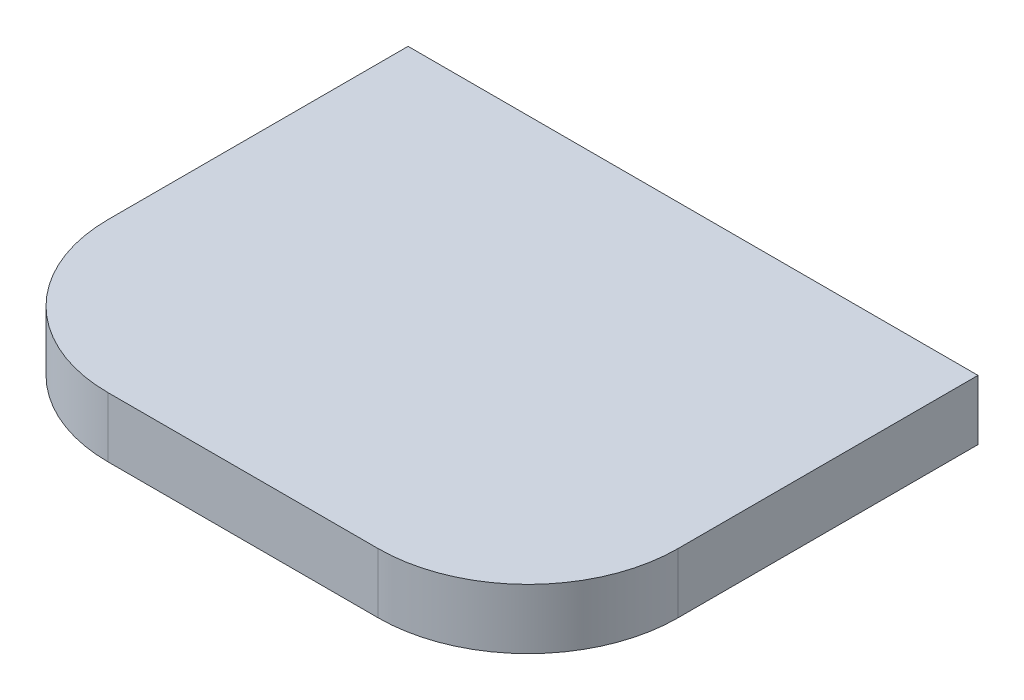
ISO-10303-21;
HEADER;
FILE_DESCRIPTION(('STEP AP214'),'2;1');
FILE_NAME('part.step','',(''),(''),'','','');
FILE_SCHEMA(('AUTOMOTIVE_DESIGN { 1 0 10303 214 1 1 1 1 }'));
ENDSEC;
DATA;
#1=APPLICATION_CONTEXT('core data for automotive mechanical design processes');
#2=APPLICATION_PROTOCOL_DEFINITION('international standard','automotive_design',2000,#1);
#3=PRODUCT_CONTEXT('',#1,'mechanical');
#4=PRODUCT('Part','Part','',(#3));
#5=PRODUCT_RELATED_PRODUCT_CATEGORY('part','',(#4));
#6=PRODUCT_DEFINITION_FORMATION('','',#4);
#7=PRODUCT_DEFINITION_CONTEXT('part definition',#1,'design');
#8=PRODUCT_DEFINITION('design','',#6,#7);
#9=PRODUCT_DEFINITION_SHAPE('','',#8);
#10=(LENGTH_UNIT() NAMED_UNIT(*) SI_UNIT(.MILLI.,.METRE.));
#11=(NAMED_UNIT(*) PLANE_ANGLE_UNIT() SI_UNIT($,.RADIAN.));
#12=(NAMED_UNIT(*) SI_UNIT($,.STERADIAN.) SOLID_ANGLE_UNIT());
#13=UNCERTAINTY_MEASURE_WITH_UNIT(LENGTH_MEASURE(1.E-05),#10,'distance_accuracy_value','');
#14=(GEOMETRIC_REPRESENTATION_CONTEXT(3) GLOBAL_UNCERTAINTY_ASSIGNED_CONTEXT((#13)) GLOBAL_UNIT_ASSIGNED_CONTEXT((#10,
#11,#12)) REPRESENTATION_CONTEXT('',''));
#15=CARTESIAN_POINT('',(0.,0.,0.));
#16=DIRECTION('',(0.,0.,1.));
#17=DIRECTION('',(1.,0.,0.));
#18=AXIS2_PLACEMENT_3D('',#15,#16,#17);
#19=CARTESIAN_POINT('',(-43.1070823408573,4.,17.625158927755));
#20=DIRECTION('',(1.,0.,0.));
#21=DIRECTION('',(0.,0.,-1.));
#22=AXIS2_PLACEMENT_3D('',#19,#20,#21);
#23=PLANE('',#22);
#24=DIRECTION('',(0.,0.,1.));
#25=VECTOR('',#24,1.);
#26=CARTESIAN_POINT('',(-43.1070823408573,0.,17.625158927755));
#27=LINE('',#26,#25);
#28=CARTESIAN_POINT('',(-43.1070823408573,0.,17.625158927755));
#29=VERTEX_POINT('',#28);
#30=CARTESIAN_POINT('',(-43.1070823408573,0.,37.625158927755));
#31=VERTEX_POINT('',#30);
#32=EDGE_CURVE('E117',#29,#31,#27,.T.);
#33=ORIENTED_EDGE('',*,*,#32,.T.);
#34=DIRECTION('',(0.,-1.,0.));
#35=VECTOR('',#34,1.);
#36=CARTESIAN_POINT('',(-43.1070823408573,4.,37.625158927755));
#37=LINE('',#36,#35);
#38=CARTESIAN_POINT('',(-43.1070823408573,4.,37.625158927755));
#39=VERTEX_POINT('',#38);
#40=EDGE_CURVE('E11',#39,#31,#37,.T.);
#41=ORIENTED_EDGE('',*,*,#40,.F.);
#42=DIRECTION('',(0.,0.,1.));
#43=VECTOR('',#42,1.);
#44=CARTESIAN_POINT('',(-43.1070823408573,4.,17.625158927755));
#45=LINE('',#44,#43);
#46=CARTESIAN_POINT('',(-43.1070823408573,4.,17.625158927755));
#47=VERTEX_POINT('',#46);
#48=EDGE_CURVE('E127',#47,#39,#45,.T.);
#49=ORIENTED_EDGE('',*,*,#48,.F.);
#50=DIRECTION('',(0.,-1.,0.));
#51=VECTOR('',#50,1.);
#52=CARTESIAN_POINT('',(-43.1070823408573,4.,17.625158927755));
#53=LINE('',#52,#51);
#54=EDGE_CURVE('E113',#47,#29,#53,.T.);
#55=ORIENTED_EDGE('',*,*,#54,.T.);
#56=EDGE_LOOP('',(#33,#41,#49,#55));
#57=FACE_BOUND('',#56,.T.);
#58=ADVANCED_FACE('F33',(#57),#23,.F.);
#59=CARTESIAN_POINT('',(-33.1070823408573,4.,37.625158927755));
#60=DIRECTION('',(0.,-1.,0.));
#61=DIRECTION('',(0.,0.,-1.));
#62=AXIS2_PLACEMENT_3D('',#59,#60,#61);
#63=CYLINDRICAL_SURFACE('',#62,10.);
#64=CARTESIAN_POINT('',(-33.1070823408573,0.,37.625158927755));
#65=DIRECTION('',(0.,1.,0.));
#66=DIRECTION('',(0.,0.,-1.));
#67=AXIS2_PLACEMENT_3D('',#64,#65,#66);
#68=CIRCLE('',#67,10.);
#69=CARTESIAN_POINT('',(-33.1070823408572,0.,47.625158927755));
#70=VERTEX_POINT('',#69);
#71=EDGE_CURVE('E120',#31,#70,#68,.T.);
#72=ORIENTED_EDGE('',*,*,#71,.T.);
#73=DIRECTION('',(0.,-1.,0.));
#74=VECTOR('',#73,1.);
#75=CARTESIAN_POINT('',(-33.1070823408572,4.,47.625158927755));
#76=LINE('',#75,#74);
#77=CARTESIAN_POINT('',(-33.1070823408572,4.,47.625158927755));
#78=VERTEX_POINT('',#77);
#79=EDGE_CURVE('E41',#78,#70,#76,.T.);
#80=ORIENTED_EDGE('',*,*,#79,.F.);
#81=CARTESIAN_POINT('',(-33.1070823408573,4.,37.625158927755));
#82=DIRECTION('',(0.,1.,0.));
#83=DIRECTION('',(0.,0.,-1.));
#84=AXIS2_PLACEMENT_3D('',#81,#82,#83);
#85=CIRCLE('',#84,10.);
#86=EDGE_CURVE('E86',#39,#78,#85,.T.);
#87=ORIENTED_EDGE('',*,*,#86,.F.);
#88=ORIENTED_EDGE('',*,*,#40,.T.);
#89=EDGE_LOOP('',(#72,#80,#87,#88));
#90=FACE_BOUND('',#89,.T.);
#91=ADVANCED_FACE('F151',(#90),#63,.T.);
#92=CARTESIAN_POINT('',(-33.1070823408572,4.,47.625158927755));
#93=DIRECTION('',(0.,0.,-1.));
#94=DIRECTION('',(-1.,0.,0.));
#95=AXIS2_PLACEMENT_3D('',#92,#93,#94);
#96=PLANE('',#95);
#97=DIRECTION('',(1.,0.,0.));
#98=VECTOR('',#97,1.);
#99=CARTESIAN_POINT('',(-33.1070823408572,0.,47.625158927755));
#100=LINE('',#99,#98);
#101=CARTESIAN_POINT('',(-15.1070823408574,0.,47.625158927755));
#102=VERTEX_POINT('',#101);
#103=EDGE_CURVE('E122',#70,#102,#100,.T.);
#104=ORIENTED_EDGE('',*,*,#103,.T.);
#105=DIRECTION('',(0.,-1.,0.));
#106=VECTOR('',#105,1.);
#107=CARTESIAN_POINT('',(-15.1070823408574,4.,47.625158927755));
#108=LINE('',#107,#106);
#109=CARTESIAN_POINT('',(-15.1070823408574,4.,47.625158927755));
#110=VERTEX_POINT('',#109);
#111=EDGE_CURVE('E108',#110,#102,#108,.T.);
#112=ORIENTED_EDGE('',*,*,#111,.F.);
#113=DIRECTION('',(1.,0.,0.));
#114=VECTOR('',#113,1.);
#115=CARTESIAN_POINT('',(-33.1070823408572,4.,47.625158927755));
#116=LINE('',#115,#114);
#117=EDGE_CURVE('E99',#78,#110,#116,.T.);
#118=ORIENTED_EDGE('',*,*,#117,.F.);
#119=ORIENTED_EDGE('',*,*,#79,.T.);
#120=EDGE_LOOP('',(#104,#112,#118,#119));
#121=FACE_BOUND('',#120,.T.);
#122=ADVANCED_FACE('F133',(#121),#96,.F.);
#123=CARTESIAN_POINT('',(-15.1070823408573,4.,37.625158927755));
#124=DIRECTION('',(0.,-1.,0.));
#125=DIRECTION('',(0.,0.,-1.));
#126=AXIS2_PLACEMENT_3D('',#123,#124,#125);
#127=CYLINDRICAL_SURFACE('',#126,10.);
#128=CARTESIAN_POINT('',(-15.1070823408573,0.,37.625158927755));
#129=DIRECTION('',(0.,1.,0.));
#130=DIRECTION('',(0.,0.,1.));
#131=AXIS2_PLACEMENT_3D('',#128,#129,#130);
#132=CIRCLE('',#131,10.);
#133=CARTESIAN_POINT('',(-5.10708234085731,0.,37.625158927755));
#134=VERTEX_POINT('',#133);
#135=EDGE_CURVE('E107',#102,#134,#132,.T.);
#136=ORIENTED_EDGE('',*,*,#135,.T.);
#137=DIRECTION('',(0.,-1.,0.));
#138=VECTOR('',#137,1.);
#139=CARTESIAN_POINT('',(-5.10708234085731,4.,37.625158927755));
#140=LINE('',#139,#138);
#141=CARTESIAN_POINT('',(-5.10708234085731,4.,37.625158927755));
#142=VERTEX_POINT('',#141);
#143=EDGE_CURVE('E104',#142,#134,#140,.T.);
#144=ORIENTED_EDGE('',*,*,#143,.F.);
#145=CARTESIAN_POINT('',(-15.1070823408573,4.,37.625158927755));
#146=DIRECTION('',(0.,1.,0.));
#147=DIRECTION('',(0.,0.,1.));
#148=AXIS2_PLACEMENT_3D('',#145,#146,#147);
#149=CIRCLE('',#148,10.);
#150=EDGE_CURVE('E93',#110,#142,#149,.T.);
#151=ORIENTED_EDGE('',*,*,#150,.F.);
#152=ORIENTED_EDGE('',*,*,#111,.T.);
#153=EDGE_LOOP('',(#136,#144,#151,#152));
#154=FACE_BOUND('',#153,.T.);
#155=ADVANCED_FACE('F105',(#154),#127,.T.);
#156=CARTESIAN_POINT('',(-5.10708234085731,4.,17.625158927755));
#157=DIRECTION('',(-1.,0.,0.));
#158=DIRECTION('',(0.,0.,1.));
#159=AXIS2_PLACEMENT_3D('',#156,#157,#158);
#160=PLANE('',#159);
#161=DIRECTION('',(0.,0.,-1.));
#162=VECTOR('',#161,1.);
#163=CARTESIAN_POINT('',(-5.10708234085731,0.,17.625158927755));
#164=LINE('',#163,#162);
#165=CARTESIAN_POINT('',(-5.10708234085731,0.,17.625158927755));
#166=VERTEX_POINT('',#165);
#167=EDGE_CURVE('E72',#134,#166,#164,.T.);
#168=ORIENTED_EDGE('',*,*,#167,.T.);
#169=DIRECTION('',(0.,-1.,0.));
#170=VECTOR('',#169,1.);
#171=CARTESIAN_POINT('',(-5.10708234085731,4.,17.625158927755));
#172=LINE('',#171,#170);
#173=CARTESIAN_POINT('',(-5.10708234085731,4.,17.625158927755));
#174=VERTEX_POINT('',#173);
#175=EDGE_CURVE('E109',#174,#166,#172,.T.);
#176=ORIENTED_EDGE('',*,*,#175,.F.);
#177=DIRECTION('',(0.,0.,-1.));
#178=VECTOR('',#177,1.);
#179=CARTESIAN_POINT('',(-5.10708234085731,4.,17.625158927755));
#180=LINE('',#179,#178);
#181=EDGE_CURVE('E97',#142,#174,#180,.T.);
#182=ORIENTED_EDGE('',*,*,#181,.F.);
#183=ORIENTED_EDGE('',*,*,#143,.T.);
#184=EDGE_LOOP('',(#168,#176,#182,#183));
#185=FACE_BOUND('',#184,.T.);
#186=ADVANCED_FACE('F111',(#185),#160,.F.);
#187=CARTESIAN_POINT('',(-43.1070823408573,4.,17.625158927755));
#188=DIRECTION('',(0.,0.,1.));
#189=DIRECTION('',(1.,0.,0.));
#190=AXIS2_PLACEMENT_3D('',#187,#188,#189);
#191=PLANE('',#190);
#192=DIRECTION('',(-1.,0.,0.));
#193=VECTOR('',#192,1.);
#194=CARTESIAN_POINT('',(-43.1070823408573,0.,17.625158927755));
#195=LINE('',#194,#193);
#196=EDGE_CURVE('E78',#166,#29,#195,.T.);
#197=ORIENTED_EDGE('',*,*,#196,.T.);
#198=ORIENTED_EDGE('',*,*,#54,.F.);
#199=DIRECTION('',(-1.,0.,0.));
#200=VECTOR('',#199,1.);
#201=CARTESIAN_POINT('',(-43.1070823408573,4.,17.625158927755));
#202=LINE('',#201,#200);
#203=EDGE_CURVE('E49',#174,#47,#202,.T.);
#204=ORIENTED_EDGE('',*,*,#203,.F.);
#205=ORIENTED_EDGE('',*,*,#175,.T.);
#206=EDGE_LOOP('',(#197,#198,#204,#205));
#207=FACE_BOUND('',#206,.T.);
#208=ADVANCED_FACE('F140',(#207),#191,.F.);
#209=CARTESIAN_POINT('',(-33.1070823408573,4.,37.625158927755));
#210=DIRECTION('',(0.,-1.,0.));
#211=DIRECTION('',(0.,0.,-1.));
#212=AXIS2_PLACEMENT_3D('',#209,#210,#211);
#213=PLANE('',#212);
#214=ORIENTED_EDGE('',*,*,#48,.T.);
#215=ORIENTED_EDGE('',*,*,#86,.T.);
#216=ORIENTED_EDGE('',*,*,#117,.T.);
#217=ORIENTED_EDGE('',*,*,#150,.T.);
#218=ORIENTED_EDGE('',*,*,#181,.T.);
#219=ORIENTED_EDGE('',*,*,#203,.T.);
#220=EDGE_LOOP('',(#214,#215,#216,#217,#218,#219));
#221=FACE_BOUND('',#220,.T.);
#222=ADVANCED_FACE('F95',(#221),#213,.F.);
#223=CARTESIAN_POINT('',(-33.1070823408573,0.,37.625158927755));
#224=DIRECTION('',(0.,-1.,0.));
#225=DIRECTION('',(0.,0.,-1.));
#226=AXIS2_PLACEMENT_3D('',#223,#224,#225);
#227=PLANE('',#226);
#228=ORIENTED_EDGE('',*,*,#32,.F.);
#229=ORIENTED_EDGE('',*,*,#196,.F.);
#230=ORIENTED_EDGE('',*,*,#167,.F.);
#231=ORIENTED_EDGE('',*,*,#135,.F.);
#232=ORIENTED_EDGE('',*,*,#103,.F.);
#233=ORIENTED_EDGE('',*,*,#71,.F.);
#234=EDGE_LOOP('',(#228,#229,#230,#231,#232,#233));
#235=FACE_BOUND('',#234,.T.);
#236=ADVANCED_FACE('F136',(#235),#227,.T.);
#237=CLOSED_SHELL('',(#58,#91,#122,#155,#186,#208,#222,#236));
#238=MANIFOLD_SOLID_BREP('B2',#237);
#239=ADVANCED_BREP_SHAPE_REPRESENTATION('',(#18,#238),#14);
#240=SHAPE_DEFINITION_REPRESENTATION(#9,#239);
ENDSEC;
END-ISO-10303-21;
